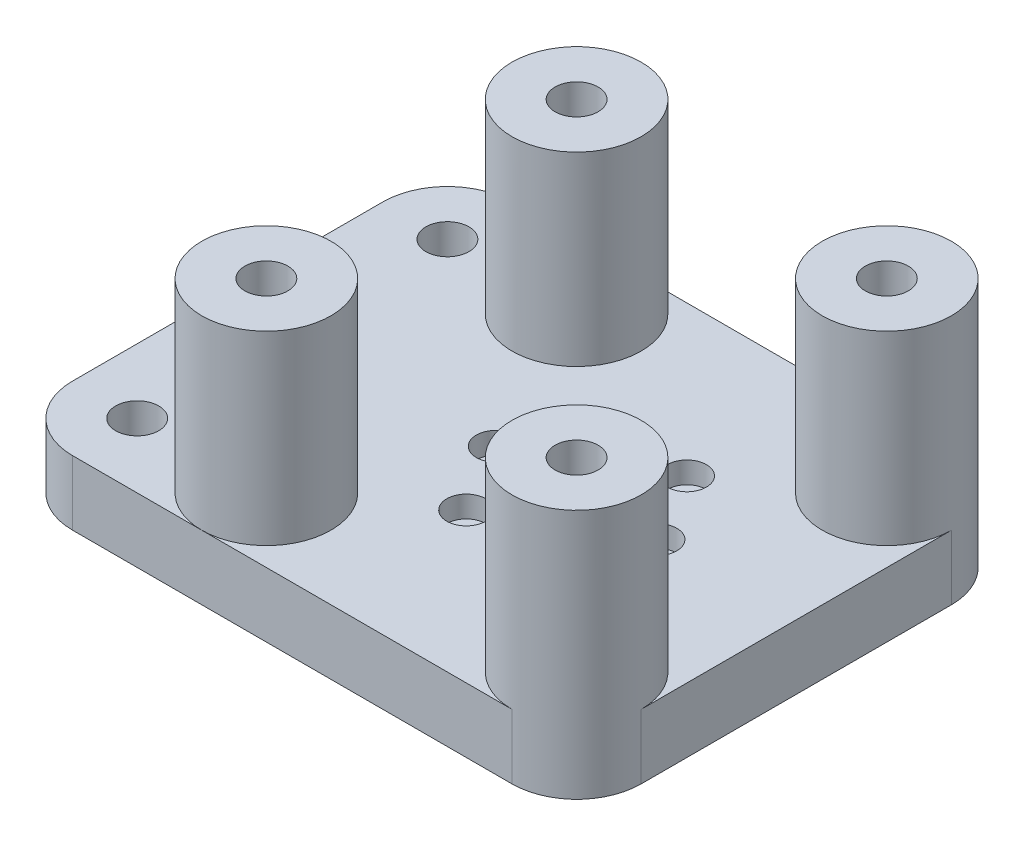
ISO-10303-21;
HEADER;
FILE_DESCRIPTION(('STEP AP214'),'2;1');
FILE_NAME('part.step','',(''),(''),'','','');
FILE_SCHEMA(('AUTOMOTIVE_DESIGN { 1 0 10303 214 1 1 1 1 }'));
ENDSEC;
DATA;
#1=APPLICATION_CONTEXT('core data for automotive mechanical design processes');
#2=APPLICATION_PROTOCOL_DEFINITION('international standard','automotive_design',2000,#1);
#3=PRODUCT_CONTEXT('',#1,'mechanical');
#4=PRODUCT('Part','Part','',(#3));
#5=PRODUCT_RELATED_PRODUCT_CATEGORY('part','',(#4));
#6=PRODUCT_DEFINITION_FORMATION('','',#4);
#7=PRODUCT_DEFINITION_CONTEXT('part definition',#1,'design');
#8=PRODUCT_DEFINITION('design','',#6,#7);
#9=PRODUCT_DEFINITION_SHAPE('','',#8);
#10=(LENGTH_UNIT() NAMED_UNIT(*) SI_UNIT(.MILLI.,.METRE.));
#11=(NAMED_UNIT(*) PLANE_ANGLE_UNIT() SI_UNIT($,.RADIAN.));
#12=(NAMED_UNIT(*) SI_UNIT($,.STERADIAN.) SOLID_ANGLE_UNIT());
#13=UNCERTAINTY_MEASURE_WITH_UNIT(LENGTH_MEASURE(1.E-05),#10,'distance_accuracy_value','');
#14=(GEOMETRIC_REPRESENTATION_CONTEXT(3) GLOBAL_UNCERTAINTY_ASSIGNED_CONTEXT((#13)) GLOBAL_UNIT_ASSIGNED_CONTEXT((#10,
#11,#12)) REPRESENTATION_CONTEXT('',''));
#15=CARTESIAN_POINT('',(0.,0.,0.));
#16=DIRECTION('',(0.,0.,1.));
#17=DIRECTION('',(1.,0.,0.));
#18=AXIS2_PLACEMENT_3D('',#15,#16,#17);
#19=CARTESIAN_POINT('',(28.8146013333518,12.,-28.8146013333518));
#20=DIRECTION('',(0.,1.,0.));
#21=DIRECTION('',(0.,0.,1.));
#22=AXIS2_PLACEMENT_3D('',#19,#20,#21);
#23=PLANE('',#22);
#24=CARTESIAN_POINT('',(-52.8146013333518,12.,28.8146013333518));
#25=DIRECTION('',(0.,1.,0.));
#26=DIRECTION('',(0.,0.,1.));
#27=AXIS2_PLACEMENT_3D('',#24,#25,#26);
#28=CIRCLE('',#27,4.00000000000001);
#29=CARTESIAN_POINT('',(-52.8146013333518,12.,32.8146013333518));
#30=VERTEX_POINT('',#29);
#31=EDGE_CURVE('E216',#30,#30,#28,.T.);
#32=ORIENTED_EDGE('',*,*,#31,.F.);
#33=EDGE_LOOP('',(#32));
#34=FACE_BOUND('',#33,.T.);
#35=CARTESIAN_POINT('',(0.,12.,0.));
#36=DIRECTION('',(0.,1.,0.));
#37=DIRECTION('',(0.,0.,1.));
#38=AXIS2_PLACEMENT_3D('',#35,#36,#37);
#39=CIRCLE('',#38,10.5);
#40=CARTESIAN_POINT('',(0.,12.,10.5));
#41=VERTEX_POINT('',#40);
#42=EDGE_CURVE('E255',#41,#41,#39,.T.);
#43=ORIENTED_EDGE('',*,*,#42,.F.);
#44=EDGE_LOOP('',(#43));
#45=FACE_BOUND('',#44,.T.);
#46=CARTESIAN_POINT('',(-52.8146013333518,12.,-28.8146013333518));
#47=DIRECTION('',(0.,1.,0.));
#48=DIRECTION('',(0.,0.,1.));
#49=AXIS2_PLACEMENT_3D('',#46,#47,#48);
#50=CIRCLE('',#49,4.00000000000001);
#51=CARTESIAN_POINT('',(-52.8146013333518,12.,-24.8146013333518));
#52=VERTEX_POINT('',#51);
#53=EDGE_CURVE('E222',#52,#52,#50,.T.);
#54=ORIENTED_EDGE('',*,*,#53,.F.);
#55=EDGE_LOOP('',(#54));
#56=FACE_BOUND('',#55,.T.);
#57=CARTESIAN_POINT('',(-7.49999999999998,12.,-12.9903810567666));
#58=DIRECTION('',(0.,1.,0.));
#59=DIRECTION('',(0.,0.,1.));
#60=AXIS2_PLACEMENT_3D('',#57,#58,#59);
#61=CIRCLE('',#60,3.625);
#62=CARTESIAN_POINT('',(-7.49999999999998,12.,-9.36538105676659));
#63=VERTEX_POINT('',#62);
#64=EDGE_CURVE('E172',#63,#63,#61,.T.);
#65=ORIENTED_EDGE('',*,*,#64,.F.);
#66=EDGE_LOOP('',(#65));
#67=FACE_BOUND('',#66,.T.);
#68=CARTESIAN_POINT('',(7.50000000000002,12.,-12.9903810567666));
#69=DIRECTION('',(0.,1.,0.));
#70=DIRECTION('',(0.,0.,1.));
#71=AXIS2_PLACEMENT_3D('',#68,#69,#70);
#72=CIRCLE('',#71,3.625);
#73=CARTESIAN_POINT('',(7.50000000000002,12.,-9.36538105676656));
#74=VERTEX_POINT('',#73);
#75=EDGE_CURVE('E177',#74,#74,#72,.T.);
#76=ORIENTED_EDGE('',*,*,#75,.F.);
#77=EDGE_LOOP('',(#76));
#78=FACE_BOUND('',#77,.T.);
#79=CARTESIAN_POINT('',(15.,12.,0.));
#80=DIRECTION('',(0.,1.,0.));
#81=DIRECTION('',(0.,0.,1.));
#82=AXIS2_PLACEMENT_3D('',#79,#80,#81);
#83=CIRCLE('',#82,3.625);
#84=CARTESIAN_POINT('',(15.,12.,3.62500000000004));
#85=VERTEX_POINT('',#84);
#86=EDGE_CURVE('E181',#85,#85,#83,.T.);
#87=ORIENTED_EDGE('',*,*,#86,.F.);
#88=EDGE_LOOP('',(#87));
#89=FACE_BOUND('',#88,.T.);
#90=CARTESIAN_POINT('',(7.49999999999997,12.,12.9903810567666));
#91=DIRECTION('',(0.,1.,0.));
#92=DIRECTION('',(0.,0.,1.));
#93=AXIS2_PLACEMENT_3D('',#90,#91,#92);
#94=CIRCLE('',#93,3.625);
#95=CARTESIAN_POINT('',(7.49999999999997,12.,16.6153810567666));
#96=VERTEX_POINT('',#95);
#97=EDGE_CURVE('E185',#96,#96,#94,.T.);
#98=ORIENTED_EDGE('',*,*,#97,.F.);
#99=EDGE_LOOP('',(#98));
#100=FACE_BOUND('',#99,.T.);
#101=CARTESIAN_POINT('',(-7.50000000000003,12.,12.9903810567666));
#102=DIRECTION('',(0.,1.,0.));
#103=DIRECTION('',(0.,0.,1.));
#104=AXIS2_PLACEMENT_3D('',#101,#102,#103);
#105=CIRCLE('',#104,3.625);
#106=CARTESIAN_POINT('',(-7.50000000000003,12.,16.6153810567666));
#107=VERTEX_POINT('',#106);
#108=EDGE_CURVE('E192',#107,#107,#105,.T.);
#109=ORIENTED_EDGE('',*,*,#108,.F.);
#110=EDGE_LOOP('',(#109));
#111=FACE_BOUND('',#110,.T.);
#112=CARTESIAN_POINT('',(-15.,12.,0.));
#113=DIRECTION('',(0.,1.,0.));
#114=DIRECTION('',(0.,0.,1.));
#115=AXIS2_PLACEMENT_3D('',#112,#113,#114);
#116=CIRCLE('',#115,3.625);
#117=CARTESIAN_POINT('',(-15.,12.,3.625));
#118=VERTEX_POINT('',#117);
#119=EDGE_CURVE('E199',#118,#118,#116,.T.);
#120=ORIENTED_EDGE('',*,*,#119,.F.);
#121=EDGE_LOOP('',(#120));
#122=FACE_BOUND('',#121,.T.);
#123=DIRECTION('',(1.,0.,0.));
#124=VECTOR('',#123,1.);
#125=CARTESIAN_POINT('',(-52.8146013333518,12.,40.8146013333518));
#126=LINE('',#125,#124);
#127=CARTESIAN_POINT('',(-52.8146013333518,12.,40.8146013333518));
#128=VERTEX_POINT('',#127);
#129=CARTESIAN_POINT('',(-28.8146013333518,12.,40.8146013333518));
#130=VERTEX_POINT('',#129);
#131=EDGE_CURVE('E111',#128,#130,#126,.T.);
#132=ORIENTED_EDGE('',*,*,#131,.T.);
#133=CARTESIAN_POINT('',(-28.8146013333518,12.,28.8146013333518));
#134=DIRECTION('',(0.,1.,0.));
#135=DIRECTION('',(0.,0.,1.));
#136=AXIS2_PLACEMENT_3D('',#133,#134,#135);
#137=CIRCLE('',#136,12.);
#138=EDGE_CURVE('E47',#130,#130,#137,.T.);
#139=ORIENTED_EDGE('',*,*,#138,.F.);
#140=CARTESIAN_POINT('',(28.8146013333519,12.,40.8146013333518));
#141=VERTEX_POINT('',#140);
#142=EDGE_CURVE('E117',#130,#141,#126,.T.);
#143=ORIENTED_EDGE('',*,*,#142,.T.);
#144=CARTESIAN_POINT('',(28.8146013333518,12.,28.8146013333518));
#145=DIRECTION('',(0.,1.,0.));
#146=DIRECTION('',(0.,0.,1.));
#147=AXIS2_PLACEMENT_3D('',#144,#145,#146);
#148=CIRCLE('',#147,12.);
#149=CARTESIAN_POINT('',(40.8146013333518,12.,28.8146013333518));
#150=VERTEX_POINT('',#149);
#151=EDGE_CURVE('E284',#150,#141,#148,.T.);
#152=ORIENTED_EDGE('',*,*,#151,.F.);
#153=DIRECTION('',(0.,0.,-1.));
#154=VECTOR('',#153,1.);
#155=CARTESIAN_POINT('',(40.8146013333518,12.,-28.8146013333518));
#156=LINE('',#155,#154);
#157=CARTESIAN_POINT('',(40.8146013333518,12.,-28.8146013333518));
#158=VERTEX_POINT('',#157);
#159=EDGE_CURVE('E55',#150,#158,#156,.T.);
#160=ORIENTED_EDGE('',*,*,#159,.T.);
#161=CARTESIAN_POINT('',(28.8146013333518,12.,-28.8146013333518));
#162=DIRECTION('',(0.,1.,0.));
#163=DIRECTION('',(0.,0.,1.));
#164=AXIS2_PLACEMENT_3D('',#161,#162,#163);
#165=CIRCLE('',#164,12.0000000000001);
#166=CARTESIAN_POINT('',(28.8146013333518,12.,-40.8146013333518));
#167=VERTEX_POINT('',#166);
#168=EDGE_CURVE('E298',#167,#158,#165,.T.);
#169=ORIENTED_EDGE('',*,*,#168,.F.);
#170=DIRECTION('',(-1.,0.,0.));
#171=VECTOR('',#170,1.);
#172=CARTESIAN_POINT('',(-52.8146013333518,12.,-40.8146013333518));
#173=LINE('',#172,#171);
#174=CARTESIAN_POINT('',(-28.8146013333518,12.,-40.8146013333518));
#175=VERTEX_POINT('',#174);
#176=EDGE_CURVE('E262',#167,#175,#173,.T.);
#177=ORIENTED_EDGE('',*,*,#176,.T.);
#178=CARTESIAN_POINT('',(-28.8146013333518,12.,-28.8146013333518));
#179=DIRECTION('',(0.,1.,0.));
#180=DIRECTION('',(0.,0.,1.));
#181=AXIS2_PLACEMENT_3D('',#178,#179,#180);
#182=CIRCLE('',#181,12.);
#183=EDGE_CURVE('E307',#175,#175,#182,.T.);
#184=ORIENTED_EDGE('',*,*,#183,.F.);
#185=CARTESIAN_POINT('',(-52.8146013333518,12.,-40.8146013333518));
#186=VERTEX_POINT('',#185);
#187=EDGE_CURVE('E97',#175,#186,#173,.T.);
#188=ORIENTED_EDGE('',*,*,#187,.T.);
#189=CARTESIAN_POINT('',(-52.8146013333518,12.,-28.8146013333518));
#190=DIRECTION('',(0.,1.,0.));
#191=DIRECTION('',(0.,0.,1.));
#192=AXIS2_PLACEMENT_3D('',#189,#190,#191);
#193=CIRCLE('',#192,12.);
#194=CARTESIAN_POINT('',(-64.8146013333518,12.,-28.8146013333518));
#195=VERTEX_POINT('',#194);
#196=EDGE_CURVE('E265',#186,#195,#193,.T.);
#197=ORIENTED_EDGE('',*,*,#196,.T.);
#198=DIRECTION('',(0.,0.,1.));
#199=VECTOR('',#198,1.);
#200=CARTESIAN_POINT('',(-64.8146013333518,12.,-28.8146013333518));
#201=LINE('',#200,#199);
#202=CARTESIAN_POINT('',(-64.8146013333518,12.,28.8146013333518));
#203=VERTEX_POINT('',#202);
#204=EDGE_CURVE('E113',#195,#203,#201,.T.);
#205=ORIENTED_EDGE('',*,*,#204,.T.);
#206=CARTESIAN_POINT('',(-52.8146013333518,12.,28.8146013333518));
#207=DIRECTION('',(0.,1.,0.));
#208=DIRECTION('',(0.,0.,1.));
#209=AXIS2_PLACEMENT_3D('',#206,#207,#208);
#210=CIRCLE('',#209,12.);
#211=EDGE_CURVE('E108',#203,#128,#210,.T.);
#212=ORIENTED_EDGE('',*,*,#211,.T.);
#213=EDGE_LOOP('',(#132,#139,#143,#152,#160,#169,#177,#184,#188,#197,#205,#212));
#214=FACE_BOUND('',#213,.T.);
#215=ADVANCED_FACE('F32',(#34,#45,#56,#67,#78,#89,#100,#111,#122,#214),#23,.T.);
#216=CARTESIAN_POINT('',(-15.,12.,0.));
#217=DIRECTION('',(0.,-1.,0.));
#218=DIRECTION('',(0.,0.,-1.));
#219=AXIS2_PLACEMENT_3D('',#216,#217,#218);
#220=CYLINDRICAL_SURFACE('',#219,2.);
#221=CARTESIAN_POINT('',(-15.,0.,0.));
#222=DIRECTION('',(0.,1.,0.));
#223=DIRECTION('',(0.,0.,1.));
#224=AXIS2_PLACEMENT_3D('',#221,#222,#223);
#225=CIRCLE('',#224,2.);
#226=CARTESIAN_POINT('',(-15.,0.,2.));
#227=VERTEX_POINT('',#226);
#228=EDGE_CURVE('E225',#227,#227,#225,.T.);
#229=ORIENTED_EDGE('',*,*,#228,.F.);
#230=EDGE_LOOP('',(#229));
#231=FACE_BOUND('',#230,.T.);
#232=CARTESIAN_POINT('',(-15.,8.,0.));
#233=DIRECTION('',(0.,1.,0.));
#234=DIRECTION('',(0.,0.,1.));
#235=AXIS2_PLACEMENT_3D('',#232,#233,#234);
#236=CIRCLE('',#235,2.);
#237=CARTESIAN_POINT('',(-15.,8.,2.));
#238=VERTEX_POINT('',#237);
#239=EDGE_CURVE('E36',#238,#238,#236,.T.);
#240=ORIENTED_EDGE('',*,*,#239,.T.);
#241=EDGE_LOOP('',(#240));
#242=FACE_BOUND('',#241,.T.);
#243=ADVANCED_FACE('F323',(#231,#242),#220,.F.);
#244=CARTESIAN_POINT('',(-7.50000000000001,12.,12.9903810567666));
#245=DIRECTION('',(0.,-1.,0.));
#246=DIRECTION('',(0.,0.,-1.));
#247=AXIS2_PLACEMENT_3D('',#244,#245,#246);
#248=CYLINDRICAL_SURFACE('',#247,2.);
#249=CARTESIAN_POINT('',(-7.50000000000001,0.,12.9903810567666));
#250=DIRECTION('',(0.,1.,0.));
#251=DIRECTION('',(0.,0.,1.));
#252=AXIS2_PLACEMENT_3D('',#249,#250,#251);
#253=CIRCLE('',#252,2.);
#254=CARTESIAN_POINT('',(-7.50000000000001,0.,14.9903810567666));
#255=VERTEX_POINT('',#254);
#256=EDGE_CURVE('E230',#255,#255,#253,.T.);
#257=ORIENTED_EDGE('',*,*,#256,.F.);
#258=EDGE_LOOP('',(#257));
#259=FACE_BOUND('',#258,.T.);
#260=CARTESIAN_POINT('',(-7.50000000000001,8.,12.9903810567666));
#261=DIRECTION('',(0.,1.,0.));
#262=DIRECTION('',(0.,0.,1.));
#263=AXIS2_PLACEMENT_3D('',#260,#261,#262);
#264=CIRCLE('',#263,2.);
#265=CARTESIAN_POINT('',(-7.50000000000001,8.,14.9903810567666));
#266=VERTEX_POINT('',#265);
#267=EDGE_CURVE('E183',#266,#266,#264,.T.);
#268=ORIENTED_EDGE('',*,*,#267,.T.);
#269=EDGE_LOOP('',(#268));
#270=FACE_BOUND('',#269,.T.);
#271=ADVANCED_FACE('F329',(#259,#270),#248,.F.);
#272=CARTESIAN_POINT('',(7.49999999999999,12.,12.9903810567666));
#273=DIRECTION('',(0.,-1.,0.));
#274=DIRECTION('',(0.,0.,-1.));
#275=AXIS2_PLACEMENT_3D('',#272,#273,#274);
#276=CYLINDRICAL_SURFACE('',#275,2.);
#277=CARTESIAN_POINT('',(7.49999999999999,0.,12.9903810567666));
#278=DIRECTION('',(0.,1.,0.));
#279=DIRECTION('',(0.,0.,1.));
#280=AXIS2_PLACEMENT_3D('',#277,#278,#279);
#281=CIRCLE('',#280,2.);
#282=CARTESIAN_POINT('',(7.49999999999999,0.,14.9903810567666));
#283=VERTEX_POINT('',#282);
#284=EDGE_CURVE('E233',#283,#283,#281,.T.);
#285=ORIENTED_EDGE('',*,*,#284,.F.);
#286=EDGE_LOOP('',(#285));
#287=FACE_BOUND('',#286,.T.);
#288=CARTESIAN_POINT('',(7.49999999999999,8.,12.9903810567666));
#289=DIRECTION('',(0.,1.,0.));
#290=DIRECTION('',(0.,0.,1.));
#291=AXIS2_PLACEMENT_3D('',#288,#289,#290);
#292=CIRCLE('',#291,2.);
#293=CARTESIAN_POINT('',(7.49999999999999,8.,14.9903810567666));
#294=VERTEX_POINT('',#293);
#295=EDGE_CURVE('E179',#294,#294,#292,.T.);
#296=ORIENTED_EDGE('',*,*,#295,.T.);
#297=EDGE_LOOP('',(#296));
#298=FACE_BOUND('',#297,.T.);
#299=ADVANCED_FACE('F441',(#287,#298),#276,.F.);
#300=CARTESIAN_POINT('',(15.,12.,0.));
#301=DIRECTION('',(0.,-1.,0.));
#302=DIRECTION('',(0.,0.,-1.));
#303=AXIS2_PLACEMENT_3D('',#300,#301,#302);
#304=CYLINDRICAL_SURFACE('',#303,2.);
#305=CARTESIAN_POINT('',(15.,0.,0.));
#306=DIRECTION('',(0.,1.,0.));
#307=DIRECTION('',(0.,0.,1.));
#308=AXIS2_PLACEMENT_3D('',#305,#306,#307);
#309=CIRCLE('',#308,2.);
#310=CARTESIAN_POINT('',(15.,0.,2.00000000000001));
#311=VERTEX_POINT('',#310);
#312=EDGE_CURVE('E236',#311,#311,#309,.T.);
#313=ORIENTED_EDGE('',*,*,#312,.F.);
#314=EDGE_LOOP('',(#313));
#315=FACE_BOUND('',#314,.T.);
#316=CARTESIAN_POINT('',(15.,8.,0.));
#317=DIRECTION('',(0.,1.,0.));
#318=DIRECTION('',(0.,0.,1.));
#319=AXIS2_PLACEMENT_3D('',#316,#317,#318);
#320=CIRCLE('',#319,2.);
#321=CARTESIAN_POINT('',(15.,8.,2.00000000000001));
#322=VERTEX_POINT('',#321);
#323=EDGE_CURVE('E174',#322,#322,#320,.T.);
#324=ORIENTED_EDGE('',*,*,#323,.T.);
#325=EDGE_LOOP('',(#324));
#326=FACE_BOUND('',#325,.T.);
#327=ADVANCED_FACE('F445',(#315,#326),#304,.F.);
#328=CARTESIAN_POINT('',(7.50000000000001,12.,-12.9903810567666));
#329=DIRECTION('',(0.,-1.,0.));
#330=DIRECTION('',(0.,0.,-1.));
#331=AXIS2_PLACEMENT_3D('',#328,#329,#330);
#332=CYLINDRICAL_SURFACE('',#331,2.);
#333=CARTESIAN_POINT('',(7.50000000000001,0.,-12.9903810567666));
#334=DIRECTION('',(0.,1.,0.));
#335=DIRECTION('',(0.,0.,1.));
#336=AXIS2_PLACEMENT_3D('',#333,#334,#335);
#337=CIRCLE('',#336,2.);
#338=CARTESIAN_POINT('',(7.50000000000001,0.,-10.9903810567666));
#339=VERTEX_POINT('',#338);
#340=EDGE_CURVE('E239',#339,#339,#337,.T.);
#341=ORIENTED_EDGE('',*,*,#340,.F.);
#342=EDGE_LOOP('',(#341));
#343=FACE_BOUND('',#342,.T.);
#344=CARTESIAN_POINT('',(7.50000000000001,8.,-12.9903810567666));
#345=DIRECTION('',(0.,1.,0.));
#346=DIRECTION('',(0.,0.,1.));
#347=AXIS2_PLACEMENT_3D('',#344,#345,#346);
#348=CIRCLE('',#347,2.);
#349=CARTESIAN_POINT('',(7.50000000000001,8.,-10.9903810567666));
#350=VERTEX_POINT('',#349);
#351=EDGE_CURVE('E169',#350,#350,#348,.T.);
#352=ORIENTED_EDGE('',*,*,#351,.T.);
#353=EDGE_LOOP('',(#352));
#354=FACE_BOUND('',#353,.T.);
#355=ADVANCED_FACE('F449',(#343,#354),#332,.F.);
#356=CARTESIAN_POINT('',(-7.49999999999998,12.,-12.9903810567666));
#357=DIRECTION('',(0.,-1.,0.));
#358=DIRECTION('',(0.,0.,-1.));
#359=AXIS2_PLACEMENT_3D('',#356,#357,#358);
#360=CYLINDRICAL_SURFACE('',#359,2.00000000000001);
#361=CARTESIAN_POINT('',(-7.49999999999998,0.,-12.9903810567666));
#362=DIRECTION('',(0.,1.,0.));
#363=DIRECTION('',(0.,0.,1.));
#364=AXIS2_PLACEMENT_3D('',#361,#362,#363);
#365=CIRCLE('',#364,2.00000000000001);
#366=CARTESIAN_POINT('',(-7.49999999999998,0.,-10.9903810567666));
#367=VERTEX_POINT('',#366);
#368=EDGE_CURVE('E242',#367,#367,#365,.T.);
#369=ORIENTED_EDGE('',*,*,#368,.F.);
#370=EDGE_LOOP('',(#369));
#371=FACE_BOUND('',#370,.T.);
#372=CARTESIAN_POINT('',(-7.49999999999998,8.,-12.9903810567666));
#373=DIRECTION('',(0.,1.,0.));
#374=DIRECTION('',(0.,0.,1.));
#375=AXIS2_PLACEMENT_3D('',#372,#373,#374);
#376=CIRCLE('',#375,2.00000000000001);
#377=CARTESIAN_POINT('',(-7.49999999999998,8.,-10.9903810567666));
#378=VERTEX_POINT('',#377);
#379=EDGE_CURVE('E164',#378,#378,#376,.T.);
#380=ORIENTED_EDGE('',*,*,#379,.T.);
#381=EDGE_LOOP('',(#380));
#382=FACE_BOUND('',#381,.T.);
#383=ADVANCED_FACE('F340',(#371,#382),#360,.F.);
#384=CARTESIAN_POINT('',(28.8146013333518,0.,-28.8146013333518));
#385=DIRECTION('',(0.,1.,0.));
#386=DIRECTION('',(0.,0.,1.));
#387=AXIS2_PLACEMENT_3D('',#384,#385,#386);
#388=PLANE('',#387);
#389=CARTESIAN_POINT('',(28.8146013333518,0.,-28.8146013333518));
#390=DIRECTION('',(0.,1.,0.));
#391=DIRECTION('',(0.,0.,1.));
#392=AXIS2_PLACEMENT_3D('',#389,#390,#391);
#393=CIRCLE('',#392,12.);
#394=CARTESIAN_POINT('',(40.8146013333518,0.,-28.8146013333518));
#395=VERTEX_POINT('',#394);
#396=CARTESIAN_POINT('',(28.8146013333518,0.,-40.8146013333518));
#397=VERTEX_POINT('',#396);
#398=EDGE_CURVE('E137',#395,#397,#393,.T.);
#399=ORIENTED_EDGE('',*,*,#398,.F.);
#400=DIRECTION('',(0.,0.,-1.));
#401=VECTOR('',#400,1.);
#402=CARTESIAN_POINT('',(40.8146013333518,0.,-28.8146013333518));
#403=LINE('',#402,#401);
#404=CARTESIAN_POINT('',(40.8146013333518,0.,28.8146013333518));
#405=VERTEX_POINT('',#404);
#406=EDGE_CURVE('E89',#405,#395,#403,.T.);
#407=ORIENTED_EDGE('',*,*,#406,.F.);
#408=CARTESIAN_POINT('',(28.8146013333518,0.,28.8146013333518));
#409=DIRECTION('',(0.,1.,0.));
#410=DIRECTION('',(0.,0.,1.));
#411=AXIS2_PLACEMENT_3D('',#408,#409,#410);
#412=CIRCLE('',#411,12.);
#413=CARTESIAN_POINT('',(28.8146013333519,0.,40.8146013333518));
#414=VERTEX_POINT('',#413);
#415=EDGE_CURVE('E150',#414,#405,#412,.T.);
#416=ORIENTED_EDGE('',*,*,#415,.F.);
#417=DIRECTION('',(1.,0.,0.));
#418=VECTOR('',#417,1.);
#419=CARTESIAN_POINT('',(-52.8146013333518,0.,40.8146013333518));
#420=LINE('',#419,#418);
#421=CARTESIAN_POINT('',(-52.8146013333518,0.,40.8146013333518));
#422=VERTEX_POINT('',#421);
#423=EDGE_CURVE('E148',#422,#414,#420,.T.);
#424=ORIENTED_EDGE('',*,*,#423,.F.);
#425=CARTESIAN_POINT('',(-52.8146013333518,0.,28.8146013333518));
#426=DIRECTION('',(0.,1.,0.));
#427=DIRECTION('',(0.,0.,1.));
#428=AXIS2_PLACEMENT_3D('',#425,#426,#427);
#429=CIRCLE('',#428,12.);
#430=CARTESIAN_POINT('',(-64.8146013333518,0.,28.8146013333518));
#431=VERTEX_POINT('',#430);
#432=EDGE_CURVE('E123',#431,#422,#429,.T.);
#433=ORIENTED_EDGE('',*,*,#432,.F.);
#434=DIRECTION('',(0.,0.,1.));
#435=VECTOR('',#434,1.);
#436=CARTESIAN_POINT('',(-64.8146013333518,0.,-28.8146013333518));
#437=LINE('',#436,#435);
#438=CARTESIAN_POINT('',(-64.8146013333518,0.,-28.8146013333518));
#439=VERTEX_POINT('',#438);
#440=EDGE_CURVE('E145',#439,#431,#437,.T.);
#441=ORIENTED_EDGE('',*,*,#440,.F.);
#442=CARTESIAN_POINT('',(-52.8146013333518,0.,-28.8146013333518));
#443=DIRECTION('',(0.,1.,0.));
#444=DIRECTION('',(0.,0.,1.));
#445=AXIS2_PLACEMENT_3D('',#442,#443,#444);
#446=CIRCLE('',#445,12.);
#447=CARTESIAN_POINT('',(-52.8146013333518,0.,-40.8146013333518));
#448=VERTEX_POINT('',#447);
#449=EDGE_CURVE('E143',#448,#439,#446,.T.);
#450=ORIENTED_EDGE('',*,*,#449,.F.);
#451=DIRECTION('',(-1.,0.,0.));
#452=VECTOR('',#451,1.);
#453=CARTESIAN_POINT('',(-52.8146013333518,0.,-40.8146013333518));
#454=LINE('',#453,#452);
#455=EDGE_CURVE('E140',#397,#448,#454,.T.);
#456=ORIENTED_EDGE('',*,*,#455,.F.);
#457=EDGE_LOOP('',(#399,#407,#416,#424,#433,#441,#450,#456));
#458=FACE_BOUND('',#457,.T.);
#459=CARTESIAN_POINT('',(-28.8146013333518,0.,-28.8146013333518));
#460=DIRECTION('',(0.,1.,0.));
#461=DIRECTION('',(0.,0.,1.));
#462=AXIS2_PLACEMENT_3D('',#459,#460,#461);
#463=CIRCLE('',#462,4.);
#464=CARTESIAN_POINT('',(-28.8146013333518,0.,-24.8146013333518));
#465=VERTEX_POINT('',#464);
#466=EDGE_CURVE('E141',#465,#465,#463,.T.);
#467=ORIENTED_EDGE('',*,*,#466,.T.);
#468=EDGE_LOOP('',(#467));
#469=FACE_BOUND('',#468,.T.);
#470=CARTESIAN_POINT('',(0.,0.,0.));
#471=DIRECTION('',(0.,1.,0.));
#472=DIRECTION('',(0.,0.,1.));
#473=AXIS2_PLACEMENT_3D('',#470,#471,#472);
#474=CIRCLE('',#473,10.5);
#475=CARTESIAN_POINT('',(0.,0.,10.5));
#476=VERTEX_POINT('',#475);
#477=EDGE_CURVE('E254',#476,#476,#474,.T.);
#478=ORIENTED_EDGE('',*,*,#477,.T.);
#479=EDGE_LOOP('',(#478));
#480=FACE_BOUND('',#479,.T.);
#481=CARTESIAN_POINT('',(28.8146013333518,0.,-28.8146013333518));
#482=DIRECTION('',(0.,1.,0.));
#483=DIRECTION('',(0.,0.,1.));
#484=AXIS2_PLACEMENT_3D('',#481,#482,#483);
#485=CIRCLE('',#484,3.99999999999998);
#486=CARTESIAN_POINT('',(28.8146013333518,0.,-24.8146013333518));
#487=VERTEX_POINT('',#486);
#488=EDGE_CURVE('E251',#487,#487,#485,.T.);
#489=ORIENTED_EDGE('',*,*,#488,.T.);
#490=EDGE_LOOP('',(#489));
#491=FACE_BOUND('',#490,.T.);
#492=CARTESIAN_POINT('',(28.8146013333518,0.,28.8146013333518));
#493=DIRECTION('',(0.,1.,0.));
#494=DIRECTION('',(0.,0.,1.));
#495=AXIS2_PLACEMENT_3D('',#492,#493,#494);
#496=CIRCLE('',#495,3.99999999999998);
#497=CARTESIAN_POINT('',(28.8146013333518,0.,32.8146013333518));
#498=VERTEX_POINT('',#497);
#499=EDGE_CURVE('E248',#498,#498,#496,.T.);
#500=ORIENTED_EDGE('',*,*,#499,.T.);
#501=EDGE_LOOP('',(#500));
#502=FACE_BOUND('',#501,.T.);
#503=CARTESIAN_POINT('',(-28.8146013333518,0.,28.8146013333518));
#504=DIRECTION('',(0.,1.,0.));
#505=DIRECTION('',(0.,0.,1.));
#506=AXIS2_PLACEMENT_3D('',#503,#504,#505);
#507=CIRCLE('',#506,3.99999999999999);
#508=CARTESIAN_POINT('',(-28.8146013333518,0.,32.8146013333518));
#509=VERTEX_POINT('',#508);
#510=EDGE_CURVE('E245',#509,#509,#507,.T.);
#511=ORIENTED_EDGE('',*,*,#510,.T.);
#512=EDGE_LOOP('',(#511));
#513=FACE_BOUND('',#512,.T.);
#514=ORIENTED_EDGE('',*,*,#368,.T.);
#515=EDGE_LOOP('',(#514));
#516=FACE_BOUND('',#515,.T.);
#517=ORIENTED_EDGE('',*,*,#340,.T.);
#518=EDGE_LOOP('',(#517));
#519=FACE_BOUND('',#518,.T.);
#520=ORIENTED_EDGE('',*,*,#312,.T.);
#521=EDGE_LOOP('',(#520));
#522=FACE_BOUND('',#521,.T.);
#523=ORIENTED_EDGE('',*,*,#284,.T.);
#524=EDGE_LOOP('',(#523));
#525=FACE_BOUND('',#524,.T.);
#526=ORIENTED_EDGE('',*,*,#256,.T.);
#527=EDGE_LOOP('',(#526));
#528=FACE_BOUND('',#527,.T.);
#529=ORIENTED_EDGE('',*,*,#228,.T.);
#530=EDGE_LOOP('',(#529));
#531=FACE_BOUND('',#530,.T.);
#532=CARTESIAN_POINT('',(-52.8146013333518,0.,-28.8146013333518));
#533=DIRECTION('',(0.,1.,0.));
#534=DIRECTION('',(0.,0.,1.));
#535=AXIS2_PLACEMENT_3D('',#532,#533,#534);
#536=CIRCLE('',#535,4.00000000000001);
#537=CARTESIAN_POINT('',(-52.8146013333518,0.,-24.8146013333518));
#538=VERTEX_POINT('',#537);
#539=EDGE_CURVE('E219',#538,#538,#536,.T.);
#540=ORIENTED_EDGE('',*,*,#539,.T.);
#541=EDGE_LOOP('',(#540));
#542=FACE_BOUND('',#541,.T.);
#543=CARTESIAN_POINT('',(-52.8146013333518,0.,28.8146013333518));
#544=DIRECTION('',(0.,1.,0.));
#545=DIRECTION('',(0.,0.,1.));
#546=AXIS2_PLACEMENT_3D('',#543,#544,#545);
#547=CIRCLE('',#546,4.00000000000001);
#548=CARTESIAN_POINT('',(-52.8146013333518,0.,32.8146013333518));
#549=VERTEX_POINT('',#548);
#550=EDGE_CURVE('E167',#549,#549,#547,.T.);
#551=ORIENTED_EDGE('',*,*,#550,.T.);
#552=EDGE_LOOP('',(#551));
#553=FACE_BOUND('',#552,.T.);
#554=ADVANCED_FACE('F276',(#458,#469,#480,#491,#502,#513,#516,#519,#522,#525,#528,#531,#542,
#553),#388,.F.);
#555=CARTESIAN_POINT('',(28.8146013333518,12.,-28.8146013333518));
#556=DIRECTION('',(0.,-1.,0.));
#557=DIRECTION('',(0.,0.,-1.));
#558=AXIS2_PLACEMENT_3D('',#555,#556,#557);
#559=CYLINDRICAL_SURFACE('',#558,12.);
#560=ORIENTED_EDGE('',*,*,#398,.T.);
#561=DIRECTION('',(0.,-1.,0.));
#562=VECTOR('',#561,1.);
#563=CARTESIAN_POINT('',(28.8146013333518,12.,-40.8146013333518));
#564=LINE('',#563,#562);
#565=EDGE_CURVE('E11',#167,#397,#564,.T.);
#566=ORIENTED_EDGE('',*,*,#565,.F.);
#567=ORIENTED_EDGE('',*,*,#168,.T.);
#568=DIRECTION('',(0.,-1.,0.));
#569=VECTOR('',#568,1.);
#570=CARTESIAN_POINT('',(40.8146013333518,12.,-28.8146013333518));
#571=LINE('',#570,#569);
#572=EDGE_CURVE('E133',#158,#395,#571,.T.);
#573=ORIENTED_EDGE('',*,*,#572,.T.);
#574=EDGE_LOOP('',(#560,#566,#567,#573));
#575=FACE_BOUND('',#574,.T.);
#576=CARTESIAN_POINT('',(28.8146013333518,46.5,-28.8146013333518));
#577=DIRECTION('',(0.,1.,0.));
#578=DIRECTION('',(0.,0.,1.));
#579=AXIS2_PLACEMENT_3D('',#576,#577,#578);
#580=CIRCLE('',#579,12.0000000000001);
#581=CARTESIAN_POINT('',(28.8146013333518,46.5,-16.8146013333517));
#582=VERTEX_POINT('',#581);
#583=EDGE_CURVE('E299',#582,#582,#580,.T.);
#584=ORIENTED_EDGE('',*,*,#583,.F.);
#585=EDGE_LOOP('',(#584));
#586=FACE_BOUND('',#585,.T.);
#587=ADVANCED_FACE('F34',(#575,#586),#559,.T.);
#588=CARTESIAN_POINT('',(-52.8146013333518,12.,-40.8146013333518));
#589=DIRECTION('',(0.,0.,1.));
#590=DIRECTION('',(1.,0.,0.));
#591=AXIS2_PLACEMENT_3D('',#588,#589,#590);
#592=PLANE('',#591);
#593=ORIENTED_EDGE('',*,*,#455,.T.);
#594=DIRECTION('',(0.,-1.,0.));
#595=VECTOR('',#594,1.);
#596=CARTESIAN_POINT('',(-52.8146013333518,12.,-40.8146013333518));
#597=LINE('',#596,#595);
#598=EDGE_CURVE('E41',#186,#448,#597,.T.);
#599=ORIENTED_EDGE('',*,*,#598,.F.);
#600=ORIENTED_EDGE('',*,*,#187,.F.);
#601=ORIENTED_EDGE('',*,*,#176,.F.);
#602=ORIENTED_EDGE('',*,*,#565,.T.);
#603=EDGE_LOOP('',(#593,#599,#600,#601,#602));
#604=FACE_BOUND('',#603,.T.);
#605=ADVANCED_FACE('F353',(#604),#592,.F.);
#606=CARTESIAN_POINT('',(-52.8146013333518,12.,-28.8146013333518));
#607=DIRECTION('',(0.,-1.,0.));
#608=DIRECTION('',(0.,0.,-1.));
#609=AXIS2_PLACEMENT_3D('',#606,#607,#608);
#610=CYLINDRICAL_SURFACE('',#609,12.);
#611=ORIENTED_EDGE('',*,*,#449,.T.);
#612=DIRECTION('',(0.,-1.,0.));
#613=VECTOR('',#612,1.);
#614=CARTESIAN_POINT('',(-64.8146013333518,12.,-28.8146013333518));
#615=LINE('',#614,#613);
#616=EDGE_CURVE('E159',#195,#439,#615,.T.);
#617=ORIENTED_EDGE('',*,*,#616,.F.);
#618=ORIENTED_EDGE('',*,*,#196,.F.);
#619=ORIENTED_EDGE('',*,*,#598,.T.);
#620=EDGE_LOOP('',(#611,#617,#618,#619));
#621=FACE_BOUND('',#620,.T.);
#622=ADVANCED_FACE('F269',(#621),#610,.T.);
#623=CARTESIAN_POINT('',(-64.8146013333518,12.,-28.8146013333518));
#624=DIRECTION('',(1.,0.,0.));
#625=DIRECTION('',(0.,0.,-1.));
#626=AXIS2_PLACEMENT_3D('',#623,#624,#625);
#627=PLANE('',#626);
#628=ORIENTED_EDGE('',*,*,#440,.T.);
#629=DIRECTION('',(0.,-1.,0.));
#630=VECTOR('',#629,1.);
#631=CARTESIAN_POINT('',(-64.8146013333518,12.,28.8146013333518));
#632=LINE('',#631,#630);
#633=EDGE_CURVE('E126',#203,#431,#632,.T.);
#634=ORIENTED_EDGE('',*,*,#633,.F.);
#635=ORIENTED_EDGE('',*,*,#204,.F.);
#636=ORIENTED_EDGE('',*,*,#616,.T.);
#637=EDGE_LOOP('',(#628,#634,#635,#636));
#638=FACE_BOUND('',#637,.T.);
#639=ADVANCED_FACE('F273',(#638),#627,.F.);
#640=CARTESIAN_POINT('',(-52.8146013333518,12.,28.8146013333518));
#641=DIRECTION('',(0.,-1.,0.));
#642=DIRECTION('',(0.,0.,-1.));
#643=AXIS2_PLACEMENT_3D('',#640,#641,#642);
#644=CYLINDRICAL_SURFACE('',#643,12.);
#645=ORIENTED_EDGE('',*,*,#432,.T.);
#646=DIRECTION('',(0.,-1.,0.));
#647=VECTOR('',#646,1.);
#648=CARTESIAN_POINT('',(-52.8146013333518,12.,40.8146013333518));
#649=LINE('',#648,#647);
#650=EDGE_CURVE('E120',#128,#422,#649,.T.);
#651=ORIENTED_EDGE('',*,*,#650,.F.);
#652=ORIENTED_EDGE('',*,*,#211,.F.);
#653=ORIENTED_EDGE('',*,*,#633,.T.);
#654=EDGE_LOOP('',(#645,#651,#652,#653));
#655=FACE_BOUND('',#654,.T.);
#656=ADVANCED_FACE('F121',(#655),#644,.T.);
#657=CARTESIAN_POINT('',(-52.8146013333518,12.,40.8146013333518));
#658=DIRECTION('',(0.,0.,-1.));
#659=DIRECTION('',(-1.,0.,0.));
#660=AXIS2_PLACEMENT_3D('',#657,#658,#659);
#661=PLANE('',#660);
#662=ORIENTED_EDGE('',*,*,#423,.T.);
#663=DIRECTION('',(0.,-1.,0.));
#664=VECTOR('',#663,1.);
#665=CARTESIAN_POINT('',(28.8146013333519,12.,40.8146013333518));
#666=LINE('',#665,#664);
#667=EDGE_CURVE('E127',#141,#414,#666,.T.);
#668=ORIENTED_EDGE('',*,*,#667,.F.);
#669=ORIENTED_EDGE('',*,*,#142,.F.);
#670=ORIENTED_EDGE('',*,*,#131,.F.);
#671=ORIENTED_EDGE('',*,*,#650,.T.);
#672=EDGE_LOOP('',(#662,#668,#669,#670,#671));
#673=FACE_BOUND('',#672,.T.);
#674=ADVANCED_FACE('F130',(#673),#661,.F.);
#675=CARTESIAN_POINT('',(28.8146013333518,12.,28.8146013333518));
#676=DIRECTION('',(0.,-1.,0.));
#677=DIRECTION('',(0.,0.,-1.));
#678=AXIS2_PLACEMENT_3D('',#675,#676,#677);
#679=CYLINDRICAL_SURFACE('',#678,12.);
#680=ORIENTED_EDGE('',*,*,#415,.T.);
#681=DIRECTION('',(0.,-1.,0.));
#682=VECTOR('',#681,1.);
#683=CARTESIAN_POINT('',(40.8146013333518,12.,28.8146013333518));
#684=LINE('',#683,#682);
#685=EDGE_CURVE('E154',#150,#405,#684,.T.);
#686=ORIENTED_EDGE('',*,*,#685,.F.);
#687=ORIENTED_EDGE('',*,*,#151,.T.);
#688=ORIENTED_EDGE('',*,*,#667,.T.);
#689=EDGE_LOOP('',(#680,#686,#687,#688));
#690=FACE_BOUND('',#689,.T.);
#691=CARTESIAN_POINT('',(28.8146013333518,46.5,28.8146013333518));
#692=DIRECTION('',(0.,1.,0.));
#693=DIRECTION('',(0.,0.,1.));
#694=AXIS2_PLACEMENT_3D('',#691,#692,#693);
#695=CIRCLE('',#694,12.);
#696=CARTESIAN_POINT('',(28.8146013333518,46.5,40.8146013333518));
#697=VERTEX_POINT('',#696);
#698=EDGE_CURVE('E286',#697,#697,#695,.T.);
#699=ORIENTED_EDGE('',*,*,#698,.F.);
#700=EDGE_LOOP('',(#699));
#701=FACE_BOUND('',#700,.T.);
#702=ADVANCED_FACE('F281',(#690,#701),#679,.T.);
#703=CARTESIAN_POINT('',(40.8146013333518,12.,-28.8146013333518));
#704=DIRECTION('',(-1.,0.,0.));
#705=DIRECTION('',(0.,0.,1.));
#706=AXIS2_PLACEMENT_3D('',#703,#704,#705);
#707=PLANE('',#706);
#708=ORIENTED_EDGE('',*,*,#406,.T.);
#709=ORIENTED_EDGE('',*,*,#572,.F.);
#710=ORIENTED_EDGE('',*,*,#159,.F.);
#711=ORIENTED_EDGE('',*,*,#685,.T.);
#712=EDGE_LOOP('',(#708,#709,#710,#711));
#713=FACE_BOUND('',#712,.T.);
#714=ADVANCED_FACE('F341',(#713),#707,.F.);
#715=CARTESIAN_POINT('',(-28.8146013333518,12.,-28.8146013333518));
#716=DIRECTION('',(0.,-1.,0.));
#717=DIRECTION('',(0.,0.,-1.));
#718=AXIS2_PLACEMENT_3D('',#715,#716,#717);
#719=CYLINDRICAL_SURFACE('',#718,4.);
#720=ORIENTED_EDGE('',*,*,#466,.F.);
#721=EDGE_LOOP('',(#720));
#722=FACE_BOUND('',#721,.T.);
#723=CARTESIAN_POINT('',(-28.8146013333518,46.5,-28.8146013333518));
#724=DIRECTION('',(0.,1.,0.));
#725=DIRECTION('',(0.,0.,1.));
#726=AXIS2_PLACEMENT_3D('',#723,#724,#725);
#727=CIRCLE('',#726,4.);
#728=CARTESIAN_POINT('',(-28.8146013333518,46.5,-24.8146013333518));
#729=VERTEX_POINT('',#728);
#730=EDGE_CURVE('E302',#729,#729,#727,.T.);
#731=ORIENTED_EDGE('',*,*,#730,.T.);
#732=EDGE_LOOP('',(#731));
#733=FACE_BOUND('',#732,.T.);
#734=ADVANCED_FACE('F336',(#722,#733),#719,.F.);
#735=CARTESIAN_POINT('',(0.,12.,0.));
#736=DIRECTION('',(0.,-1.,0.));
#737=DIRECTION('',(0.,0.,-1.));
#738=AXIS2_PLACEMENT_3D('',#735,#736,#737);
#739=CYLINDRICAL_SURFACE('',#738,10.5);
#740=ORIENTED_EDGE('',*,*,#42,.T.);
#741=EDGE_LOOP('',(#740));
#742=FACE_BOUND('',#741,.T.);
#743=ORIENTED_EDGE('',*,*,#477,.F.);
#744=EDGE_LOOP('',(#743));
#745=FACE_BOUND('',#744,.T.);
#746=ADVANCED_FACE('F466',(#742,#745),#739,.F.);
#747=CARTESIAN_POINT('',(28.8146013333518,12.,-28.8146013333518));
#748=DIRECTION('',(0.,-1.,0.));
#749=DIRECTION('',(0.,0.,-1.));
#750=AXIS2_PLACEMENT_3D('',#747,#748,#749);
#751=CYLINDRICAL_SURFACE('',#750,3.99999999999998);
#752=ORIENTED_EDGE('',*,*,#488,.F.);
#753=EDGE_LOOP('',(#752));
#754=FACE_BOUND('',#753,.T.);
#755=CARTESIAN_POINT('',(28.8146013333518,46.5,-28.8146013333518));
#756=DIRECTION('',(0.,1.,0.));
#757=DIRECTION('',(0.,0.,1.));
#758=AXIS2_PLACEMENT_3D('',#755,#756,#757);
#759=CIRCLE('',#758,4.00000000000013);
#760=CARTESIAN_POINT('',(28.8146013333518,46.5,-24.8146013333517));
#761=VERTEX_POINT('',#760);
#762=EDGE_CURVE('E290',#761,#761,#759,.T.);
#763=ORIENTED_EDGE('',*,*,#762,.T.);
#764=EDGE_LOOP('',(#763));
#765=FACE_BOUND('',#764,.T.);
#766=ADVANCED_FACE('F463',(#754,#765),#751,.F.);
#767=CARTESIAN_POINT('',(28.8146013333518,12.,28.8146013333518));
#768=DIRECTION('',(0.,-1.,0.));
#769=DIRECTION('',(0.,0.,-1.));
#770=AXIS2_PLACEMENT_3D('',#767,#768,#769);
#771=CYLINDRICAL_SURFACE('',#770,3.99999999999998);
#772=ORIENTED_EDGE('',*,*,#499,.F.);
#773=EDGE_LOOP('',(#772));
#774=FACE_BOUND('',#773,.T.);
#775=CARTESIAN_POINT('',(28.8146013333518,46.5,28.8146013333518));
#776=DIRECTION('',(0.,1.,0.));
#777=DIRECTION('',(0.,0.,1.));
#778=AXIS2_PLACEMENT_3D('',#775,#776,#777);
#779=CIRCLE('',#778,4.00000000000024);
#780=CARTESIAN_POINT('',(28.8146013333518,46.5,32.814601333352));
#781=VERTEX_POINT('',#780);
#782=EDGE_CURVE('E287',#781,#781,#779,.T.);
#783=ORIENTED_EDGE('',*,*,#782,.T.);
#784=EDGE_LOOP('',(#783));
#785=FACE_BOUND('',#784,.T.);
#786=ADVANCED_FACE('F459',(#774,#785),#771,.F.);
#787=CARTESIAN_POINT('',(-28.8146013333518,12.,28.8146013333518));
#788=DIRECTION('',(0.,-1.,0.));
#789=DIRECTION('',(0.,0.,-1.));
#790=AXIS2_PLACEMENT_3D('',#787,#788,#789);
#791=CYLINDRICAL_SURFACE('',#790,3.99999999999999);
#792=ORIENTED_EDGE('',*,*,#510,.F.);
#793=EDGE_LOOP('',(#792));
#794=FACE_BOUND('',#793,.T.);
#795=CARTESIAN_POINT('',(-28.8146013333518,46.5,28.8146013333518));
#796=DIRECTION('',(0.,1.,0.));
#797=DIRECTION('',(0.,0.,1.));
#798=AXIS2_PLACEMENT_3D('',#795,#796,#797);
#799=CIRCLE('',#798,4.00000000000037);
#800=CARTESIAN_POINT('',(-28.8146013333518,46.5,32.8146013333522));
#801=VERTEX_POINT('',#800);
#802=EDGE_CURVE('E538',#801,#801,#799,.T.);
#803=ORIENTED_EDGE('',*,*,#802,.T.);
#804=EDGE_LOOP('',(#803));
#805=FACE_BOUND('',#804,.T.);
#806=ADVANCED_FACE('F436',(#794,#805),#791,.F.);
#807=CARTESIAN_POINT('',(-52.8146013333518,12.,-28.8146013333518));
#808=DIRECTION('',(0.,-1.,0.));
#809=DIRECTION('',(0.,0.,-1.));
#810=AXIS2_PLACEMENT_3D('',#807,#808,#809);
#811=CYLINDRICAL_SURFACE('',#810,4.00000000000001);
#812=ORIENTED_EDGE('',*,*,#53,.T.);
#813=EDGE_LOOP('',(#812));
#814=FACE_BOUND('',#813,.T.);
#815=ORIENTED_EDGE('',*,*,#539,.F.);
#816=EDGE_LOOP('',(#815));
#817=FACE_BOUND('',#816,.T.);
#818=ADVANCED_FACE('F433',(#814,#817),#811,.F.);
#819=CARTESIAN_POINT('',(-52.8146013333518,12.,28.8146013333518));
#820=DIRECTION('',(0.,-1.,0.));
#821=DIRECTION('',(0.,0.,-1.));
#822=AXIS2_PLACEMENT_3D('',#819,#820,#821);
#823=CYLINDRICAL_SURFACE('',#822,4.00000000000001);
#824=ORIENTED_EDGE('',*,*,#31,.T.);
#825=EDGE_LOOP('',(#824));
#826=FACE_BOUND('',#825,.T.);
#827=ORIENTED_EDGE('',*,*,#550,.F.);
#828=EDGE_LOOP('',(#827));
#829=FACE_BOUND('',#828,.T.);
#830=ADVANCED_FACE('F429',(#826,#829),#823,.F.);
#831=CARTESIAN_POINT('',(-7.49999999999998,8.,-12.9903810567666));
#832=DIRECTION('',(0.,1.,0.));
#833=DIRECTION('',(0.,0.,1.));
#834=AXIS2_PLACEMENT_3D('',#831,#832,#833);
#835=CYLINDRICAL_SURFACE('',#834,3.625);
#836=CARTESIAN_POINT('',(-7.49999999999998,8.,-12.9903810567666));
#837=DIRECTION('',(0.,1.,0.));
#838=DIRECTION('',(0.,0.,1.));
#839=AXIS2_PLACEMENT_3D('',#836,#837,#838);
#840=CIRCLE('',#839,3.625);
#841=CARTESIAN_POINT('',(-7.49999999999998,8.,-9.36538105676659));
#842=VERTEX_POINT('',#841);
#843=EDGE_CURVE('E168',#842,#842,#840,.T.);
#844=ORIENTED_EDGE('',*,*,#843,.F.);
#845=EDGE_LOOP('',(#844));
#846=FACE_BOUND('',#845,.T.);
#847=ORIENTED_EDGE('',*,*,#64,.T.);
#848=EDGE_LOOP('',(#847));
#849=FACE_BOUND('',#848,.T.);
#850=ADVANCED_FACE('F425',(#846,#849),#835,.F.);
#851=CARTESIAN_POINT('',(-7.49999999999998,8.,-12.9903810567666));
#852=DIRECTION('',(0.,1.,0.));
#853=DIRECTION('',(0.,0.,1.));
#854=AXIS2_PLACEMENT_3D('',#851,#852,#853);
#855=PLANE('',#854);
#856=ORIENTED_EDGE('',*,*,#379,.F.);
#857=EDGE_LOOP('',(#856));
#858=FACE_BOUND('',#857,.T.);
#859=ORIENTED_EDGE('',*,*,#843,.T.);
#860=EDGE_LOOP('',(#859));
#861=FACE_BOUND('',#860,.T.);
#862=ADVANCED_FACE('F421',(#858,#861),#855,.T.);
#863=CARTESIAN_POINT('',(7.50000000000002,8.,-12.9903810567666));
#864=DIRECTION('',(0.,1.,0.));
#865=DIRECTION('',(0.,0.,1.));
#866=AXIS2_PLACEMENT_3D('',#863,#864,#865);
#867=CYLINDRICAL_SURFACE('',#866,3.625);
#868=CARTESIAN_POINT('',(7.50000000000002,8.,-12.9903810567666));
#869=DIRECTION('',(0.,1.,0.));
#870=DIRECTION('',(0.,0.,1.));
#871=AXIS2_PLACEMENT_3D('',#868,#869,#870);
#872=CIRCLE('',#871,3.625);
#873=CARTESIAN_POINT('',(7.50000000000002,8.,-9.36538105676656));
#874=VERTEX_POINT('',#873);
#875=EDGE_CURVE('E173',#874,#874,#872,.T.);
#876=ORIENTED_EDGE('',*,*,#875,.F.);
#877=EDGE_LOOP('',(#876));
#878=FACE_BOUND('',#877,.T.);
#879=ORIENTED_EDGE('',*,*,#75,.T.);
#880=EDGE_LOOP('',(#879));
#881=FACE_BOUND('',#880,.T.);
#882=ADVANCED_FACE('F417',(#878,#881),#867,.F.);
#883=CARTESIAN_POINT('',(7.50000000000002,8.,-12.9903810567666));
#884=DIRECTION('',(0.,1.,0.));
#885=DIRECTION('',(0.,0.,1.));
#886=AXIS2_PLACEMENT_3D('',#883,#884,#885);
#887=PLANE('',#886);
#888=ORIENTED_EDGE('',*,*,#351,.F.);
#889=EDGE_LOOP('',(#888));
#890=FACE_BOUND('',#889,.T.);
#891=ORIENTED_EDGE('',*,*,#875,.T.);
#892=EDGE_LOOP('',(#891));
#893=FACE_BOUND('',#892,.T.);
#894=ADVANCED_FACE('F413',(#890,#893),#887,.T.);
#895=CARTESIAN_POINT('',(15.,8.,0.));
#896=DIRECTION('',(0.,1.,0.));
#897=DIRECTION('',(0.,0.,1.));
#898=AXIS2_PLACEMENT_3D('',#895,#896,#897);
#899=CYLINDRICAL_SURFACE('',#898,3.625);
#900=CARTESIAN_POINT('',(15.,8.,0.));
#901=DIRECTION('',(0.,1.,0.));
#902=DIRECTION('',(0.,0.,1.));
#903=AXIS2_PLACEMENT_3D('',#900,#901,#902);
#904=CIRCLE('',#903,3.625);
#905=CARTESIAN_POINT('',(15.,8.,3.62500000000004));
#906=VERTEX_POINT('',#905);
#907=EDGE_CURVE('E178',#906,#906,#904,.T.);
#908=ORIENTED_EDGE('',*,*,#907,.F.);
#909=EDGE_LOOP('',(#908));
#910=FACE_BOUND('',#909,.T.);
#911=ORIENTED_EDGE('',*,*,#86,.T.);
#912=EDGE_LOOP('',(#911));
#913=FACE_BOUND('',#912,.T.);
#914=ADVANCED_FACE('F409',(#910,#913),#899,.F.);
#915=CARTESIAN_POINT('',(15.,8.,0.));
#916=DIRECTION('',(0.,1.,0.));
#917=DIRECTION('',(0.,0.,1.));
#918=AXIS2_PLACEMENT_3D('',#915,#916,#917);
#919=PLANE('',#918);
#920=ORIENTED_EDGE('',*,*,#323,.F.);
#921=EDGE_LOOP('',(#920));
#922=FACE_BOUND('',#921,.T.);
#923=ORIENTED_EDGE('',*,*,#907,.T.);
#924=EDGE_LOOP('',(#923));
#925=FACE_BOUND('',#924,.T.);
#926=ADVANCED_FACE('F405',(#922,#925),#919,.T.);
#927=CARTESIAN_POINT('',(7.49999999999997,8.,12.9903810567666));
#928=DIRECTION('',(0.,1.,0.));
#929=DIRECTION('',(0.,0.,1.));
#930=AXIS2_PLACEMENT_3D('',#927,#928,#929);
#931=CYLINDRICAL_SURFACE('',#930,3.625);
#932=CARTESIAN_POINT('',(7.49999999999997,8.,12.9903810567666));
#933=DIRECTION('',(0.,1.,0.));
#934=DIRECTION('',(0.,0.,1.));
#935=AXIS2_PLACEMENT_3D('',#932,#933,#934);
#936=CIRCLE('',#935,3.625);
#937=CARTESIAN_POINT('',(7.49999999999997,8.,16.6153810567666));
#938=VERTEX_POINT('',#937);
#939=EDGE_CURVE('E182',#938,#938,#936,.T.);
#940=ORIENTED_EDGE('',*,*,#939,.F.);
#941=EDGE_LOOP('',(#940));
#942=FACE_BOUND('',#941,.T.);
#943=ORIENTED_EDGE('',*,*,#97,.T.);
#944=EDGE_LOOP('',(#943));
#945=FACE_BOUND('',#944,.T.);
#946=ADVANCED_FACE('F401',(#942,#945),#931,.F.);
#947=CARTESIAN_POINT('',(7.49999999999997,8.,12.9903810567666));
#948=DIRECTION('',(0.,1.,0.));
#949=DIRECTION('',(0.,0.,1.));
#950=AXIS2_PLACEMENT_3D('',#947,#948,#949);
#951=PLANE('',#950);
#952=ORIENTED_EDGE('',*,*,#295,.F.);
#953=EDGE_LOOP('',(#952));
#954=FACE_BOUND('',#953,.T.);
#955=ORIENTED_EDGE('',*,*,#939,.T.);
#956=EDGE_LOOP('',(#955));
#957=FACE_BOUND('',#956,.T.);
#958=ADVANCED_FACE('F397',(#954,#957),#951,.T.);
#959=CARTESIAN_POINT('',(-7.50000000000003,8.,12.9903810567666));
#960=DIRECTION('',(0.,1.,0.));
#961=DIRECTION('',(0.,0.,1.));
#962=AXIS2_PLACEMENT_3D('',#959,#960,#961);
#963=CYLINDRICAL_SURFACE('',#962,3.625);
#964=CARTESIAN_POINT('',(-7.50000000000003,8.,12.9903810567666));
#965=DIRECTION('',(0.,1.,0.));
#966=DIRECTION('',(0.,0.,1.));
#967=AXIS2_PLACEMENT_3D('',#964,#965,#966);
#968=CIRCLE('',#967,3.625);
#969=CARTESIAN_POINT('',(-7.50000000000003,8.,16.6153810567666));
#970=VERTEX_POINT('',#969);
#971=EDGE_CURVE('E186',#970,#970,#968,.T.);
#972=ORIENTED_EDGE('',*,*,#971,.F.);
#973=EDGE_LOOP('',(#972));
#974=FACE_BOUND('',#973,.T.);
#975=ORIENTED_EDGE('',*,*,#108,.T.);
#976=EDGE_LOOP('',(#975));
#977=FACE_BOUND('',#976,.T.);
#978=ADVANCED_FACE('F393',(#974,#977),#963,.F.);
#979=CARTESIAN_POINT('',(-7.50000000000003,8.,12.9903810567666));
#980=DIRECTION('',(0.,1.,0.));
#981=DIRECTION('',(0.,0.,1.));
#982=AXIS2_PLACEMENT_3D('',#979,#980,#981);
#983=PLANE('',#982);
#984=ORIENTED_EDGE('',*,*,#267,.F.);
#985=EDGE_LOOP('',(#984));
#986=FACE_BOUND('',#985,.T.);
#987=ORIENTED_EDGE('',*,*,#971,.T.);
#988=EDGE_LOOP('',(#987));
#989=FACE_BOUND('',#988,.T.);
#990=ADVANCED_FACE('F389',(#986,#989),#983,.T.);
#991=CARTESIAN_POINT('',(-15.,8.,0.));
#992=DIRECTION('',(0.,1.,0.));
#993=DIRECTION('',(0.,0.,1.));
#994=AXIS2_PLACEMENT_3D('',#991,#992,#993);
#995=CYLINDRICAL_SURFACE('',#994,3.625);
#996=CARTESIAN_POINT('',(-15.,8.,0.));
#997=DIRECTION('',(0.,1.,0.));
#998=DIRECTION('',(0.,0.,1.));
#999=AXIS2_PLACEMENT_3D('',#996,#997,#998);
#1000=CIRCLE('',#999,3.625);
#1001=CARTESIAN_POINT('',(-15.,8.,3.625));
#1002=VERTEX_POINT('',#1001);
#1003=EDGE_CURVE('E312',#1002,#1002,#1000,.T.);
#1004=ORIENTED_EDGE('',*,*,#1003,.F.);
#1005=EDGE_LOOP('',(#1004));
#1006=FACE_BOUND('',#1005,.T.);
#1007=ORIENTED_EDGE('',*,*,#119,.T.);
#1008=EDGE_LOOP('',(#1007));
#1009=FACE_BOUND('',#1008,.T.);
#1010=ADVANCED_FACE('F320',(#1006,#1009),#995,.F.);
#1011=CARTESIAN_POINT('',(-15.,8.,0.));
#1012=DIRECTION('',(0.,1.,0.));
#1013=DIRECTION('',(0.,0.,1.));
#1014=AXIS2_PLACEMENT_3D('',#1011,#1012,#1013);
#1015=PLANE('',#1014);
#1016=ORIENTED_EDGE('',*,*,#239,.F.);
#1017=EDGE_LOOP('',(#1016));
#1018=FACE_BOUND('',#1017,.T.);
#1019=ORIENTED_EDGE('',*,*,#1003,.T.);
#1020=EDGE_LOOP('',(#1019));
#1021=FACE_BOUND('',#1020,.T.);
#1022=ADVANCED_FACE('F379',(#1018,#1021),#1015,.T.);
#1023=CARTESIAN_POINT('',(-28.8146013333518,46.5,-28.8146013333518));
#1024=DIRECTION('',(0.,1.,0.));
#1025=DIRECTION('',(0.,0.,1.));
#1026=AXIS2_PLACEMENT_3D('',#1023,#1024,#1025);
#1027=PLANE('',#1026);
#1028=CARTESIAN_POINT('',(-28.8146013333518,46.5,-28.8146013333518));
#1029=DIRECTION('',(0.,1.,0.));
#1030=DIRECTION('',(0.,0.,1.));
#1031=AXIS2_PLACEMENT_3D('',#1028,#1029,#1030);
#1032=CIRCLE('',#1031,12.);
#1033=CARTESIAN_POINT('',(-28.8146013333518,46.5,-16.8146013333518));
#1034=VERTEX_POINT('',#1033);
#1035=EDGE_CURVE('E308',#1034,#1034,#1032,.T.);
#1036=ORIENTED_EDGE('',*,*,#1035,.T.);
#1037=EDGE_LOOP('',(#1036));
#1038=FACE_BOUND('',#1037,.T.);
#1039=ORIENTED_EDGE('',*,*,#730,.F.);
#1040=EDGE_LOOP('',(#1039));
#1041=FACE_BOUND('',#1040,.T.);
#1042=ADVANCED_FACE('F369',(#1038,#1041),#1027,.T.);
#1043=CARTESIAN_POINT('',(-28.8146013333518,46.5,-28.8146013333518));
#1044=DIRECTION('',(0.,-1.,0.));
#1045=DIRECTION('',(0.,0.,-1.));
#1046=AXIS2_PLACEMENT_3D('',#1043,#1044,#1045);
#1047=CYLINDRICAL_SURFACE('',#1046,12.);
#1048=ORIENTED_EDGE('',*,*,#1035,.F.);
#1049=EDGE_LOOP('',(#1048));
#1050=FACE_BOUND('',#1049,.T.);
#1051=ORIENTED_EDGE('',*,*,#183,.T.);
#1052=EDGE_LOOP('',(#1051));
#1053=FACE_BOUND('',#1052,.T.);
#1054=ADVANCED_FACE('F366',(#1050,#1053),#1047,.T.);
#1055=CARTESIAN_POINT('',(28.8146013333518,46.5,-28.8146013333518));
#1056=DIRECTION('',(0.,1.,0.));
#1057=DIRECTION('',(0.,0.,1.));
#1058=AXIS2_PLACEMENT_3D('',#1055,#1056,#1057);
#1059=PLANE('',#1058);
#1060=ORIENTED_EDGE('',*,*,#583,.T.);
#1061=EDGE_LOOP('',(#1060));
#1062=FACE_BOUND('',#1061,.T.);
#1063=ORIENTED_EDGE('',*,*,#762,.F.);
#1064=EDGE_LOOP('',(#1063));
#1065=FACE_BOUND('',#1064,.T.);
#1066=ADVANCED_FACE('F368',(#1062,#1065),#1059,.T.);
#1067=CARTESIAN_POINT('',(28.8146013333518,46.5,28.8146013333518));
#1068=DIRECTION('',(0.,1.,0.));
#1069=DIRECTION('',(0.,0.,1.));
#1070=AXIS2_PLACEMENT_3D('',#1067,#1068,#1069);
#1071=PLANE('',#1070);
#1072=ORIENTED_EDGE('',*,*,#698,.T.);
#1073=EDGE_LOOP('',(#1072));
#1074=FACE_BOUND('',#1073,.T.);
#1075=ORIENTED_EDGE('',*,*,#782,.F.);
#1076=EDGE_LOOP('',(#1075));
#1077=FACE_BOUND('',#1076,.T.);
#1078=ADVANCED_FACE('F376',(#1074,#1077),#1071,.T.);
#1079=CARTESIAN_POINT('',(-28.8146013333518,46.5,28.8146013333518));
#1080=DIRECTION('',(0.,1.,0.));
#1081=DIRECTION('',(0.,0.,1.));
#1082=AXIS2_PLACEMENT_3D('',#1079,#1080,#1081);
#1083=PLANE('',#1082);
#1084=CARTESIAN_POINT('',(-28.8146013333518,46.5,28.8146013333518));
#1085=DIRECTION('',(0.,1.,0.));
#1086=DIRECTION('',(0.,0.,1.));
#1087=AXIS2_PLACEMENT_3D('',#1084,#1085,#1086);
#1088=CIRCLE('',#1087,12.);
#1089=CARTESIAN_POINT('',(-28.8146013333518,46.5,40.8146013333518));
#1090=VERTEX_POINT('',#1089);
#1091=EDGE_CURVE('E293',#1090,#1090,#1088,.T.);
#1092=ORIENTED_EDGE('',*,*,#1091,.T.);
#1093=EDGE_LOOP('',(#1092));
#1094=FACE_BOUND('',#1093,.T.);
#1095=ORIENTED_EDGE('',*,*,#802,.F.);
#1096=EDGE_LOOP('',(#1095));
#1097=FACE_BOUND('',#1096,.T.);
#1098=ADVANCED_FACE('F546',(#1094,#1097),#1083,.T.);
#1099=CARTESIAN_POINT('',(-28.8146013333518,46.5,28.8146013333518));
#1100=DIRECTION('',(0.,-1.,0.));
#1101=DIRECTION('',(0.,0.,-1.));
#1102=AXIS2_PLACEMENT_3D('',#1099,#1100,#1101);
#1103=CYLINDRICAL_SURFACE('',#1102,12.);
#1104=ORIENTED_EDGE('',*,*,#1091,.F.);
#1105=EDGE_LOOP('',(#1104));
#1106=FACE_BOUND('',#1105,.T.);
#1107=ORIENTED_EDGE('',*,*,#138,.T.);
#1108=EDGE_LOOP('',(#1107));
#1109=FACE_BOUND('',#1108,.T.);
#1110=ADVANCED_FACE('F548',(#1106,#1109),#1103,.T.);
#1111=CLOSED_SHELL('',(#215,#243,#271,#299,#327,#355,#383,#554,#587,#605,#622,#639,#656,#674,
#702,#714,#734,#746,#766,#786,#806,#818,#830,#850,#862,#882,#894,#914,#926,#946,#958,#978,#990,
#1010,#1022,#1042,#1054,#1066,#1078,#1098,#1110));
#1112=MANIFOLD_SOLID_BREP('B2',#1111);
#1113=ADVANCED_BREP_SHAPE_REPRESENTATION('',(#18,#1112),#14);
#1114=SHAPE_DEFINITION_REPRESENTATION(#9,#1113);
ENDSEC;
END-ISO-10303-21;
